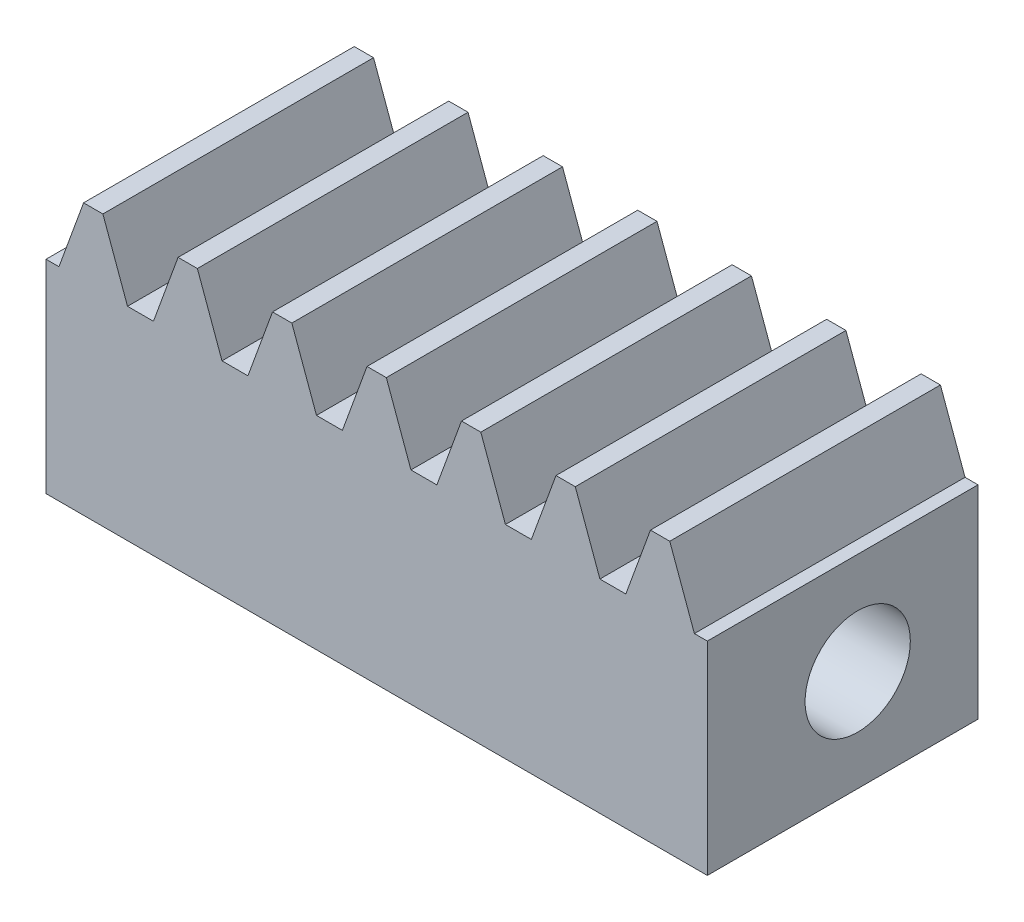
ISO-10303-21;
HEADER;
FILE_DESCRIPTION(('STEP AP214'),'2;1');
FILE_NAME('part.step','',(''),(''),'','','');
FILE_SCHEMA(('AUTOMOTIVE_DESIGN { 1 0 10303 214 1 1 1 1 }'));
ENDSEC;
DATA;
#1=APPLICATION_CONTEXT('core data for automotive mechanical design processes');
#2=APPLICATION_PROTOCOL_DEFINITION('international standard','automotive_design',2000,#1);
#3=PRODUCT_CONTEXT('',#1,'mechanical');
#4=PRODUCT('Part','Part','',(#3));
#5=PRODUCT_RELATED_PRODUCT_CATEGORY('part','',(#4));
#6=PRODUCT_DEFINITION_FORMATION('','',#4);
#7=PRODUCT_DEFINITION_CONTEXT('part definition',#1,'design');
#8=PRODUCT_DEFINITION('design','',#6,#7);
#9=PRODUCT_DEFINITION_SHAPE('','',#8);
#10=(LENGTH_UNIT() NAMED_UNIT(*) SI_UNIT(.MILLI.,.METRE.));
#11=(NAMED_UNIT(*) PLANE_ANGLE_UNIT() SI_UNIT($,.RADIAN.));
#12=(NAMED_UNIT(*) SI_UNIT($,.STERADIAN.) SOLID_ANGLE_UNIT());
#13=UNCERTAINTY_MEASURE_WITH_UNIT(LENGTH_MEASURE(1.E-05),#10,'distance_accuracy_value','');
#14=(GEOMETRIC_REPRESENTATION_CONTEXT(3) GLOBAL_UNCERTAINTY_ASSIGNED_CONTEXT((#13)) GLOBAL_UNIT_ASSIGNED_CONTEXT((#10,
#11,#12)) REPRESENTATION_CONTEXT('',''));
#15=CARTESIAN_POINT('',(0.,0.,0.));
#16=DIRECTION('',(0.,0.,1.));
#17=DIRECTION('',(1.,0.,0.));
#18=AXIS2_PLACEMENT_3D('',#15,#16,#17);
#19=CARTESIAN_POINT('',(0.,42.,20.));
#20=DIRECTION('',(0.,1.,0.));
#21=DIRECTION('',(0.,0.,-1.));
#22=AXIS2_PLACEMENT_3D('',#19,#20,#21);
#23=PLANE('',#22);
#24=DIRECTION('',(1.,0.,0.));
#25=VECTOR('',#24,1.);
#26=CARTESIAN_POINT('',(40.1988485935324,42.,3.33974571428572));
#27=LINE('',#26,#25);
#28=CARTESIAN_POINT('',(40.1988485935324,42.,3.33974571428572));
#29=VERTEX_POINT('',#28);
#30=CARTESIAN_POINT('',(41.4825603064676,42.,3.33974571428572));
#31=VERTEX_POINT('',#30);
#32=EDGE_CURVE('E715',#29,#31,#27,.T.);
#33=ORIENTED_EDGE('',*,*,#32,.F.);
#34=DIRECTION('',(0.,0.,1.));
#35=VECTOR('',#34,1.);
#36=CARTESIAN_POINT('',(40.1988485935324,42.,20.));
#37=LINE('',#36,#35);
#38=CARTESIAN_POINT('',(40.1988485935324,42.,21.3397457142857));
#39=VERTEX_POINT('',#38);
#40=EDGE_CURVE('E555',#29,#39,#37,.T.);
#41=ORIENTED_EDGE('',*,*,#40,.T.);
#42=DIRECTION('',(1.,0.,0.));
#43=VECTOR('',#42,1.);
#44=CARTESIAN_POINT('',(-18.0497899871147,42.,21.3397457142857));
#45=LINE('',#44,#43);
#46=CARTESIAN_POINT('',(41.4825603064676,42.,21.3397457142857));
#47=VERTEX_POINT('',#46);
#48=EDGE_CURVE('E552',#39,#47,#45,.T.);
#49=ORIENTED_EDGE('',*,*,#48,.T.);
#50=DIRECTION('',(0.,0.,-1.));
#51=VECTOR('',#50,1.);
#52=CARTESIAN_POINT('',(41.4825603064676,42.,20.));
#53=LINE('',#52,#51);
#54=EDGE_CURVE('E554',#47,#31,#53,.T.);
#55=ORIENTED_EDGE('',*,*,#54,.T.);
#56=EDGE_LOOP('',(#33,#41,#49,#55));
#57=FACE_BOUND('',#56,.T.);
#58=ADVANCED_FACE('F316',(#57),#23,.T.);
#59=DIRECTION('',(1.,0.,0.));
#60=VECTOR('',#59,1.);
#61=CARTESIAN_POINT('',(33.9156632935324,42.,3.33974571428572));
#62=LINE('',#61,#60);
#63=CARTESIAN_POINT('',(33.9156632935324,42.,3.33974571428572));
#64=VERTEX_POINT('',#63);
#65=CARTESIAN_POINT('',(35.1993750064676,42.,3.33974571428572));
#66=VERTEX_POINT('',#65);
#67=EDGE_CURVE('E695',#64,#66,#62,.T.);
#68=ORIENTED_EDGE('',*,*,#67,.F.);
#69=DIRECTION('',(0.,0.,1.));
#70=VECTOR('',#69,1.);
#71=CARTESIAN_POINT('',(33.9156632935324,42.,20.));
#72=LINE('',#71,#70);
#73=CARTESIAN_POINT('',(33.9156632935324,42.,21.3397457142857));
#74=VERTEX_POINT('',#73);
#75=EDGE_CURVE('E809',#64,#74,#72,.T.);
#76=ORIENTED_EDGE('',*,*,#75,.T.);
#77=CARTESIAN_POINT('',(35.1993750064676,42.,21.3397457142857));
#78=VERTEX_POINT('',#77);
#79=EDGE_CURVE('E556',#74,#78,#45,.T.);
#80=ORIENTED_EDGE('',*,*,#79,.T.);
#81=DIRECTION('',(0.,0.,-1.));
#82=VECTOR('',#81,1.);
#83=CARTESIAN_POINT('',(35.1993750064676,42.,20.));
#84=LINE('',#83,#82);
#85=EDGE_CURVE('E806',#78,#66,#84,.T.);
#86=ORIENTED_EDGE('',*,*,#85,.T.);
#87=EDGE_LOOP('',(#68,#76,#80,#86));
#88=FACE_BOUND('',#87,.T.);
#89=ADVANCED_FACE('F991',(#88),#23,.T.);
#90=DIRECTION('',(1.,0.,0.));
#91=VECTOR('',#90,1.);
#92=CARTESIAN_POINT('',(27.6324779935324,42.,3.33974571428572));
#93=LINE('',#92,#91);
#94=CARTESIAN_POINT('',(27.6324779935324,42.,3.33974571428572));
#95=VERTEX_POINT('',#94);
#96=CARTESIAN_POINT('',(28.9161897064676,42.,3.33974571428572));
#97=VERTEX_POINT('',#96);
#98=EDGE_CURVE('E675',#95,#97,#93,.T.);
#99=ORIENTED_EDGE('',*,*,#98,.F.);
#100=DIRECTION('',(0.,0.,1.));
#101=VECTOR('',#100,1.);
#102=CARTESIAN_POINT('',(27.6324779935324,42.,20.));
#103=LINE('',#102,#101);
#104=CARTESIAN_POINT('',(27.6324779935324,42.,21.3397457142857));
#105=VERTEX_POINT('',#104);
#106=EDGE_CURVE('E800',#95,#105,#103,.T.);
#107=ORIENTED_EDGE('',*,*,#106,.T.);
#108=CARTESIAN_POINT('',(28.9161897064676,42.,21.3397457142857));
#109=VERTEX_POINT('',#108);
#110=EDGE_CURVE('E791',#105,#109,#45,.T.);
#111=ORIENTED_EDGE('',*,*,#110,.T.);
#112=DIRECTION('',(0.,0.,-1.));
#113=VECTOR('',#112,1.);
#114=CARTESIAN_POINT('',(28.9161897064676,42.,20.));
#115=LINE('',#114,#113);
#116=EDGE_CURVE('E797',#109,#97,#115,.T.);
#117=ORIENTED_EDGE('',*,*,#116,.T.);
#118=EDGE_LOOP('',(#99,#107,#111,#117));
#119=FACE_BOUND('',#118,.T.);
#120=ADVANCED_FACE('F979',(#119),#23,.T.);
#121=DIRECTION('',(1.,0.,0.));
#122=VECTOR('',#121,1.);
#123=CARTESIAN_POINT('',(21.3492926935324,42.,3.33974571428572));
#124=LINE('',#123,#122);
#125=CARTESIAN_POINT('',(21.3492926935324,42.,3.33974571428572));
#126=VERTEX_POINT('',#125);
#127=CARTESIAN_POINT('',(22.6330044064676,42.,3.33974571428572));
#128=VERTEX_POINT('',#127);
#129=EDGE_CURVE('E655',#126,#128,#124,.T.);
#130=ORIENTED_EDGE('',*,*,#129,.F.);
#131=DIRECTION('',(0.,0.,1.));
#132=VECTOR('',#131,1.);
#133=CARTESIAN_POINT('',(21.3492926935324,42.,20.));
#134=LINE('',#133,#132);
#135=CARTESIAN_POINT('',(21.3492926935324,42.,21.3397457142857));
#136=VERTEX_POINT('',#135);
#137=EDGE_CURVE('E790',#126,#136,#134,.T.);
#138=ORIENTED_EDGE('',*,*,#137,.T.);
#139=CARTESIAN_POINT('',(22.6330044064676,42.,21.3397457142857));
#140=VERTEX_POINT('',#139);
#141=EDGE_CURVE('E782',#136,#140,#45,.T.);
#142=ORIENTED_EDGE('',*,*,#141,.T.);
#143=DIRECTION('',(0.,0.,-1.));
#144=VECTOR('',#143,1.);
#145=CARTESIAN_POINT('',(22.6330044064676,42.,20.));
#146=LINE('',#145,#144);
#147=EDGE_CURVE('E788',#140,#128,#146,.T.);
#148=ORIENTED_EDGE('',*,*,#147,.T.);
#149=EDGE_LOOP('',(#130,#138,#142,#148));
#150=FACE_BOUND('',#149,.T.);
#151=ADVANCED_FACE('F997',(#150),#23,.T.);
#152=DIRECTION('',(1.,0.,0.));
#153=VECTOR('',#152,1.);
#154=CARTESIAN_POINT('',(15.0661073935324,42.,3.33974571428572));
#155=LINE('',#154,#153);
#156=CARTESIAN_POINT('',(15.0661073935324,42.,3.33974571428572));
#157=VERTEX_POINT('',#156);
#158=CARTESIAN_POINT('',(16.3498191064676,42.,3.33974571428572));
#159=VERTEX_POINT('',#158);
#160=EDGE_CURVE('E635',#157,#159,#155,.T.);
#161=ORIENTED_EDGE('',*,*,#160,.F.);
#162=DIRECTION('',(0.,0.,1.));
#163=VECTOR('',#162,1.);
#164=CARTESIAN_POINT('',(15.0661073935324,42.,20.));
#165=LINE('',#164,#163);
#166=CARTESIAN_POINT('',(15.0661073935324,42.,21.3397457142857));
#167=VERTEX_POINT('',#166);
#168=EDGE_CURVE('E781',#157,#167,#165,.T.);
#169=ORIENTED_EDGE('',*,*,#168,.T.);
#170=CARTESIAN_POINT('',(16.3498191064676,42.,21.3397457142857));
#171=VERTEX_POINT('',#170);
#172=EDGE_CURVE('E777',#167,#171,#45,.T.);
#173=ORIENTED_EDGE('',*,*,#172,.T.);
#174=DIRECTION('',(0.,0.,-1.));
#175=VECTOR('',#174,1.);
#176=CARTESIAN_POINT('',(16.3498191064676,42.,20.));
#177=LINE('',#176,#175);
#178=EDGE_CURVE('E779',#171,#159,#177,.T.);
#179=ORIENTED_EDGE('',*,*,#178,.T.);
#180=EDGE_LOOP('',(#161,#169,#173,#179));
#181=FACE_BOUND('',#180,.T.);
#182=ADVANCED_FACE('F1007',(#181),#23,.T.);
#183=DIRECTION('',(1.,0.,0.));
#184=VECTOR('',#183,1.);
#185=CARTESIAN_POINT('',(8.78292209353239,42.,3.33974571428572));
#186=LINE('',#185,#184);
#187=CARTESIAN_POINT('',(8.78292209353239,42.,3.33974571428572));
#188=VERTEX_POINT('',#187);
#189=CARTESIAN_POINT('',(10.0666338064676,42.,3.33974571428572));
#190=VERTEX_POINT('',#189);
#191=EDGE_CURVE('E609',#188,#190,#186,.T.);
#192=ORIENTED_EDGE('',*,*,#191,.F.);
#193=DIRECTION('',(0.,0.,1.));
#194=VECTOR('',#193,1.);
#195=CARTESIAN_POINT('',(8.7829220935324,42.,20.));
#196=LINE('',#195,#194);
#197=CARTESIAN_POINT('',(8.7829220935324,42.,21.3397457142857));
#198=VERTEX_POINT('',#197);
#199=EDGE_CURVE('E570',#188,#198,#196,.T.);
#200=ORIENTED_EDGE('',*,*,#199,.T.);
#201=CARTESIAN_POINT('',(10.0666338064676,42.,21.3397457142857));
#202=VERTEX_POINT('',#201);
#203=EDGE_CURVE('E770',#198,#202,#45,.T.);
#204=ORIENTED_EDGE('',*,*,#203,.T.);
#205=DIRECTION('',(0.,0.,-1.));
#206=VECTOR('',#205,1.);
#207=CARTESIAN_POINT('',(10.0666338064676,42.,20.));
#208=LINE('',#207,#206);
#209=EDGE_CURVE('E583',#202,#190,#208,.T.);
#210=ORIENTED_EDGE('',*,*,#209,.T.);
#211=EDGE_LOOP('',(#192,#200,#204,#210));
#212=FACE_BOUND('',#211,.T.);
#213=ADVANCED_FACE('F929',(#212),#23,.T.);
#214=DIRECTION('',(1.,0.,0.));
#215=VECTOR('',#214,1.);
#216=CARTESIAN_POINT('',(2.49973679353239,42.,3.33974571428572));
#217=LINE('',#216,#215);
#218=CARTESIAN_POINT('',(2.49973679353239,42.,3.33974571428572));
#219=VERTEX_POINT('',#218);
#220=CARTESIAN_POINT('',(3.78344850646761,42.,3.33974571428572));
#221=VERTEX_POINT('',#220);
#222=EDGE_CURVE('E607',#219,#221,#217,.T.);
#223=ORIENTED_EDGE('',*,*,#222,.F.);
#224=DIRECTION('',(0.,0.,1.));
#225=VECTOR('',#224,1.);
#226=CARTESIAN_POINT('',(2.49973679353239,42.,20.));
#227=LINE('',#226,#225);
#228=CARTESIAN_POINT('',(2.4997367935324,42.,21.3397457142857));
#229=VERTEX_POINT('',#228);
#230=EDGE_CURVE('E319',#219,#229,#227,.T.);
#231=ORIENTED_EDGE('',*,*,#230,.T.);
#232=CARTESIAN_POINT('',(3.78344850646761,42.,21.3397457142857));
#233=VERTEX_POINT('',#232);
#234=EDGE_CURVE('E557',#229,#233,#45,.T.);
#235=ORIENTED_EDGE('',*,*,#234,.T.);
#236=DIRECTION('',(0.,0.,-1.));
#237=VECTOR('',#236,1.);
#238=CARTESIAN_POINT('',(3.78344850646762,42.,20.));
#239=LINE('',#238,#237);
#240=EDGE_CURVE('E551',#233,#221,#239,.T.);
#241=ORIENTED_EDGE('',*,*,#240,.T.);
#242=EDGE_LOOP('',(#223,#231,#235,#241));
#243=FACE_BOUND('',#242,.T.);
#244=ADVANCED_FACE('F764',(#243),#23,.T.);
#245=CARTESIAN_POINT('',(0.,0.,20.));
#246=DIRECTION('',(-1.,0.,0.));
#247=DIRECTION('',(0.,0.,-1.));
#248=AXIS2_PLACEMENT_3D('',#245,#246,#247);
#249=PLANE('',#248);
#250=DIRECTION('',(0.,1.,0.));
#251=VECTOR('',#250,1.);
#252=CARTESIAN_POINT('',(0.,24.,3.33974571428572));
#253=LINE('',#252,#251);
#254=CARTESIAN_POINT('',(0.,24.,3.33974571428572));
#255=VERTEX_POINT('',#254);
#256=CARTESIAN_POINT('',(0.,37.5,3.33974571428572));
#257=VERTEX_POINT('',#256);
#258=EDGE_CURVE('E735',#255,#257,#253,.T.);
#259=ORIENTED_EDGE('',*,*,#258,.F.);
#260=DIRECTION('',(0.,0.,-1.));
#261=VECTOR('',#260,1.);
#262=CARTESIAN_POINT('',(0.,24.,20.));
#263=LINE('',#262,#261);
#264=CARTESIAN_POINT('',(0.,24.,21.3397457142857));
#265=VERTEX_POINT('',#264);
#266=EDGE_CURVE('E456',#265,#255,#263,.T.);
#267=ORIENTED_EDGE('',*,*,#266,.F.);
#268=DIRECTION('',(0.,1.,0.));
#269=VECTOR('',#268,1.);
#270=CARTESIAN_POINT('',(0.,24.,21.3397457142857));
#271=LINE('',#270,#269);
#272=CARTESIAN_POINT('',(0.,37.5,21.3397457142857));
#273=VERTEX_POINT('',#272);
#274=EDGE_CURVE('E436',#265,#273,#271,.T.);
#275=ORIENTED_EDGE('',*,*,#274,.T.);
#276=DIRECTION('',(0.,0.,-1.));
#277=VECTOR('',#276,1.);
#278=CARTESIAN_POINT('',(0.,37.5,20.));
#279=LINE('',#278,#277);
#280=EDGE_CURVE('E477',#273,#257,#279,.T.);
#281=ORIENTED_EDGE('',*,*,#280,.T.);
#282=EDGE_LOOP('',(#259,#267,#275,#281));
#283=FACE_BOUND('',#282,.T.);
#284=CARTESIAN_POINT('',(0.,30.75,11.3397457142857));
#285=DIRECTION('',(-1.,0.,0.));
#286=DIRECTION('',(0.,0.,1.));
#287=AXIS2_PLACEMENT_3D('',#284,#285,#286);
#288=CIRCLE('',#287,3.5);
#289=CARTESIAN_POINT('',(0.,30.75,14.8397457142857));
#290=VERTEX_POINT('',#289);
#291=EDGE_CURVE('E459',#290,#290,#288,.T.);
#292=ORIENTED_EDGE('',*,*,#291,.F.);
#293=EDGE_LOOP('',(#292));
#294=FACE_BOUND('',#293,.T.);
#295=ADVANCED_FACE('F1001',(#283,#294),#249,.T.);
#296=CARTESIAN_POINT('',(2.50898163748275,42.0254,20.));
#297=DIRECTION('',(0.93969262078591,-0.342020143325663,0.));
#298=DIRECTION('',(0.342020143325663,0.939692620785911,0.));
#299=AXIS2_PLACEMENT_3D('',#296,#297,#298);
#300=PLANE('',#299);
#301=ORIENTED_EDGE('',*,*,#230,.F.);
#302=DIRECTION('',(0.342020143325662,0.939692620785911,0.));
#303=VECTOR('',#302,1.);
#304=CARTESIAN_POINT('',(0.861870739334514,37.5,3.33974571428572));
#305=LINE('',#304,#303);
#306=CARTESIAN_POINT('',(0.861870739334514,37.5,3.33974571428572));
#307=VERTEX_POINT('',#306);
#308=EDGE_CURVE('E751',#307,#219,#305,.T.);
#309=ORIENTED_EDGE('',*,*,#308,.F.);
#310=DIRECTION('',(0.,0.,-1.));
#311=VECTOR('',#310,1.);
#312=CARTESIAN_POINT('',(0.861870739334514,37.5,20.));
#313=LINE('',#312,#311);
#314=CARTESIAN_POINT('',(0.861870739334514,37.5,21.3397457142857));
#315=VERTEX_POINT('',#314);
#316=EDGE_CURVE('E476',#315,#307,#313,.T.);
#317=ORIENTED_EDGE('',*,*,#316,.F.);
#318=DIRECTION('',(0.342020143325663,0.939692620785911,0.));
#319=VECTOR('',#318,1.);
#320=CARTESIAN_POINT('',(2.50898163748275,42.0254,21.3397457142857));
#321=LINE('',#320,#319);
#322=EDGE_CURVE('E342',#315,#229,#321,.T.);
#323=ORIENTED_EDGE('',*,*,#322,.T.);
#324=EDGE_LOOP('',(#301,#309,#317,#323));
#325=FACE_BOUND('',#324,.T.);
#326=ADVANCED_FACE('F768',(#325),#300,.F.);
#327=CARTESIAN_POINT('',(0.861870739334514,37.5,20.));
#328=DIRECTION('',(0.,-1.,0.));
#329=DIRECTION('',(0.,0.,1.));
#330=AXIS2_PLACEMENT_3D('',#327,#328,#329);
#331=PLANE('',#330);
#332=ORIENTED_EDGE('',*,*,#316,.T.);
#333=DIRECTION('',(1.,0.,0.));
#334=VECTOR('',#333,1.);
#335=CARTESIAN_POINT('',(0.,37.5,3.33974571428572));
#336=LINE('',#335,#334);
#337=EDGE_CURVE('E739',#257,#307,#336,.T.);
#338=ORIENTED_EDGE('',*,*,#337,.F.);
#339=ORIENTED_EDGE('',*,*,#280,.F.);
#340=DIRECTION('',(1.,0.,0.));
#341=VECTOR('',#340,1.);
#342=CARTESIAN_POINT('',(0.861870739334514,37.5,21.3397457142857));
#343=LINE('',#342,#341);
#344=EDGE_CURVE('E478',#273,#315,#343,.T.);
#345=ORIENTED_EDGE('',*,*,#344,.T.);
#346=EDGE_LOOP('',(#332,#338,#339,#345));
#347=FACE_BOUND('',#346,.T.);
#348=ADVANCED_FACE('F1062',(#347),#331,.F.);
#349=CARTESIAN_POINT('',(3.77420366251726,42.0254,20.));
#350=DIRECTION('',(-0.93969262078591,-0.342020143325663,0.));
#351=DIRECTION('',(0.342020143325663,-0.939692620785911,0.));
#352=AXIS2_PLACEMENT_3D('',#349,#350,#351);
#353=PLANE('',#352);
#354=DIRECTION('',(0.,0.,-1.));
#355=VECTOR('',#354,1.);
#356=CARTESIAN_POINT('',(5.4213145606655,37.5,20.));
#357=LINE('',#356,#355);
#358=CARTESIAN_POINT('',(5.4213145606655,37.5,21.3397457142857));
#359=VERTEX_POINT('',#358);
#360=CARTESIAN_POINT('',(5.4213145606655,37.5,3.33974571428572));
#361=VERTEX_POINT('',#360);
#362=EDGE_CURVE('E480',#359,#361,#357,.T.);
#363=ORIENTED_EDGE('',*,*,#362,.T.);
#364=DIRECTION('',(0.342020143325664,-0.93969262078591,0.));
#365=VECTOR('',#364,1.);
#366=CARTESIAN_POINT('',(3.78344850646761,42.,3.33974571428572));
#367=LINE('',#366,#365);
#368=EDGE_CURVE('E594',#221,#361,#367,.T.);
#369=ORIENTED_EDGE('',*,*,#368,.F.);
#370=ORIENTED_EDGE('',*,*,#240,.F.);
#371=DIRECTION('',(0.342020143325663,-0.939692620785911,0.));
#372=VECTOR('',#371,1.);
#373=CARTESIAN_POINT('',(3.77420366251726,42.0254,21.3397457142857));
#374=LINE('',#373,#372);
#375=EDGE_CURVE('E481',#233,#359,#374,.T.);
#376=ORIENTED_EDGE('',*,*,#375,.T.);
#377=EDGE_LOOP('',(#363,#369,#370,#376));
#378=FACE_BOUND('',#377,.T.);
#379=ADVANCED_FACE('F590',(#378),#353,.F.);
#380=CARTESIAN_POINT('',(8.79216693748275,42.0254,20.));
#381=DIRECTION('',(0.93969262078591,-0.342020143325663,0.));
#382=DIRECTION('',(0.342020143325663,0.939692620785911,0.));
#383=AXIS2_PLACEMENT_3D('',#380,#381,#382);
#384=PLANE('',#383);
#385=ORIENTED_EDGE('',*,*,#199,.F.);
#386=DIRECTION('',(0.342020143325662,0.939692620785911,0.));
#387=VECTOR('',#386,1.);
#388=CARTESIAN_POINT('',(7.14505603933452,37.5,3.33974571428572));
#389=LINE('',#388,#387);
#390=CARTESIAN_POINT('',(7.14505603933452,37.5,3.33974571428572));
#391=VERTEX_POINT('',#390);
#392=EDGE_CURVE('E605',#391,#188,#389,.T.);
#393=ORIENTED_EDGE('',*,*,#392,.F.);
#394=DIRECTION('',(0.,0.,-1.));
#395=VECTOR('',#394,1.);
#396=CARTESIAN_POINT('',(7.14505603933452,37.5,20.));
#397=LINE('',#396,#395);
#398=CARTESIAN_POINT('',(7.14505603933452,37.5,21.3397457142857));
#399=VERTEX_POINT('',#398);
#400=EDGE_CURVE('E487',#399,#391,#397,.T.);
#401=ORIENTED_EDGE('',*,*,#400,.F.);
#402=DIRECTION('',(0.342020143325663,0.939692620785911,0.));
#403=VECTOR('',#402,1.);
#404=CARTESIAN_POINT('',(8.79216693748275,42.0254,21.3397457142857));
#405=LINE('',#404,#403);
#406=EDGE_CURVE('E484',#399,#198,#405,.T.);
#407=ORIENTED_EDGE('',*,*,#406,.T.);
#408=EDGE_LOOP('',(#385,#393,#401,#407));
#409=FACE_BOUND('',#408,.T.);
#410=ADVANCED_FACE('F930',(#409),#384,.F.);
#411=CARTESIAN_POINT('',(7.14505603933452,37.5,20.));
#412=DIRECTION('',(0.,-1.,0.));
#413=DIRECTION('',(0.,0.,1.));
#414=AXIS2_PLACEMENT_3D('',#411,#412,#413);
#415=PLANE('',#414);
#416=ORIENTED_EDGE('',*,*,#400,.T.);
#417=DIRECTION('',(1.,0.,0.));
#418=VECTOR('',#417,1.);
#419=CARTESIAN_POINT('',(5.4213145606655,37.5,3.33974571428572));
#420=LINE('',#419,#418);
#421=EDGE_CURVE('E602',#361,#391,#420,.T.);
#422=ORIENTED_EDGE('',*,*,#421,.F.);
#423=ORIENTED_EDGE('',*,*,#362,.F.);
#424=DIRECTION('',(1.,0.,0.));
#425=VECTOR('',#424,1.);
#426=CARTESIAN_POINT('',(7.14505603933452,37.5,21.3397457142857));
#427=LINE('',#426,#425);
#428=EDGE_CURVE('E488',#359,#399,#427,.T.);
#429=ORIENTED_EDGE('',*,*,#428,.T.);
#430=EDGE_LOOP('',(#416,#422,#423,#429));
#431=FACE_BOUND('',#430,.T.);
#432=ADVANCED_FACE('F599',(#431),#415,.F.);
#433=CARTESIAN_POINT('',(10.0573889625173,42.0254,20.));
#434=DIRECTION('',(-0.93969262078591,-0.342020143325663,0.));
#435=DIRECTION('',(0.342020143325663,-0.939692620785911,0.));
#436=AXIS2_PLACEMENT_3D('',#433,#434,#435);
#437=PLANE('',#436);
#438=DIRECTION('',(0.,0.,-1.));
#439=VECTOR('',#438,1.);
#440=CARTESIAN_POINT('',(11.7044998606655,37.5,20.));
#441=LINE('',#440,#439);
#442=CARTESIAN_POINT('',(11.7044998606655,37.5,21.3397457142857));
#443=VERTEX_POINT('',#442);
#444=CARTESIAN_POINT('',(11.7044998606655,37.5,3.33974571428572));
#445=VERTEX_POINT('',#444);
#446=EDGE_CURVE('E491',#443,#445,#441,.T.);
#447=ORIENTED_EDGE('',*,*,#446,.T.);
#448=DIRECTION('',(0.342020143325664,-0.93969262078591,0.));
#449=VECTOR('',#448,1.);
#450=CARTESIAN_POINT('',(10.0666338064676,42.,3.33974571428572));
#451=LINE('',#450,#449);
#452=EDGE_CURVE('E620',#190,#445,#451,.T.);
#453=ORIENTED_EDGE('',*,*,#452,.F.);
#454=ORIENTED_EDGE('',*,*,#209,.F.);
#455=DIRECTION('',(0.342020143325663,-0.939692620785911,0.));
#456=VECTOR('',#455,1.);
#457=CARTESIAN_POINT('',(10.0573889625173,42.0254,21.3397457142857));
#458=LINE('',#457,#456);
#459=EDGE_CURVE('E492',#202,#443,#458,.T.);
#460=ORIENTED_EDGE('',*,*,#459,.T.);
#461=EDGE_LOOP('',(#447,#453,#454,#460));
#462=FACE_BOUND('',#461,.T.);
#463=ADVANCED_FACE('F934',(#462),#437,.F.);
#464=CARTESIAN_POINT('',(15.0753522374828,42.0254,20.));
#465=DIRECTION('',(0.93969262078591,-0.342020143325663,0.));
#466=DIRECTION('',(0.342020143325663,0.939692620785911,0.));
#467=AXIS2_PLACEMENT_3D('',#464,#465,#466);
#468=PLANE('',#467);
#469=ORIENTED_EDGE('',*,*,#168,.F.);
#470=DIRECTION('',(0.342020143325662,0.939692620785911,0.));
#471=VECTOR('',#470,1.);
#472=CARTESIAN_POINT('',(13.4282413393345,37.5,3.33974571428572));
#473=LINE('',#472,#471);
#474=CARTESIAN_POINT('',(13.4282413393345,37.5,3.33974571428572));
#475=VERTEX_POINT('',#474);
#476=EDGE_CURVE('E630',#475,#157,#473,.T.);
#477=ORIENTED_EDGE('',*,*,#476,.F.);
#478=DIRECTION('',(0.,0.,-1.));
#479=VECTOR('',#478,1.);
#480=CARTESIAN_POINT('',(13.4282413393345,37.5,20.));
#481=LINE('',#480,#479);
#482=CARTESIAN_POINT('',(13.4282413393345,37.5,21.3397457142857));
#483=VERTEX_POINT('',#482);
#484=EDGE_CURVE('E498',#483,#475,#481,.T.);
#485=ORIENTED_EDGE('',*,*,#484,.F.);
#486=DIRECTION('',(0.342020143325663,0.939692620785911,0.));
#487=VECTOR('',#486,1.);
#488=CARTESIAN_POINT('',(15.0753522374828,42.0254,21.3397457142857));
#489=LINE('',#488,#487);
#490=EDGE_CURVE('E495',#483,#167,#489,.T.);
#491=ORIENTED_EDGE('',*,*,#490,.T.);
#492=EDGE_LOOP('',(#469,#477,#485,#491));
#493=FACE_BOUND('',#492,.T.);
#494=ADVANCED_FACE('F1019',(#493),#468,.F.);
#495=CARTESIAN_POINT('',(13.4282413393345,37.5,20.));
#496=DIRECTION('',(0.,-1.,0.));
#497=DIRECTION('',(0.,0.,1.));
#498=AXIS2_PLACEMENT_3D('',#495,#496,#497);
#499=PLANE('',#498);
#500=ORIENTED_EDGE('',*,*,#484,.T.);
#501=DIRECTION('',(1.,0.,0.));
#502=VECTOR('',#501,1.);
#503=CARTESIAN_POINT('',(11.7044998606655,37.5,3.33974571428572));
#504=LINE('',#503,#502);
#505=EDGE_CURVE('E625',#445,#475,#504,.T.);
#506=ORIENTED_EDGE('',*,*,#505,.F.);
#507=ORIENTED_EDGE('',*,*,#446,.F.);
#508=DIRECTION('',(1.,0.,0.));
#509=VECTOR('',#508,1.);
#510=CARTESIAN_POINT('',(13.4282413393345,37.5,21.3397457142857));
#511=LINE('',#510,#509);
#512=EDGE_CURVE('E499',#443,#483,#511,.T.);
#513=ORIENTED_EDGE('',*,*,#512,.T.);
#514=EDGE_LOOP('',(#500,#506,#507,#513));
#515=FACE_BOUND('',#514,.T.);
#516=ADVANCED_FACE('F938',(#515),#499,.F.);
#517=CARTESIAN_POINT('',(16.3405742625173,42.0254,20.));
#518=DIRECTION('',(-0.93969262078591,-0.342020143325663,0.));
#519=DIRECTION('',(0.342020143325663,-0.939692620785911,0.));
#520=AXIS2_PLACEMENT_3D('',#517,#518,#519);
#521=PLANE('',#520);
#522=DIRECTION('',(0.,0.,-1.));
#523=VECTOR('',#522,1.);
#524=CARTESIAN_POINT('',(17.9876851606655,37.5,20.));
#525=LINE('',#524,#523);
#526=CARTESIAN_POINT('',(17.9876851606655,37.5,21.3397457142857));
#527=VERTEX_POINT('',#526);
#528=CARTESIAN_POINT('',(17.9876851606655,37.5,3.33974571428572));
#529=VERTEX_POINT('',#528);
#530=EDGE_CURVE('E502',#527,#529,#525,.T.);
#531=ORIENTED_EDGE('',*,*,#530,.T.);
#532=DIRECTION('',(0.342020143325664,-0.93969262078591,0.));
#533=VECTOR('',#532,1.);
#534=CARTESIAN_POINT('',(16.3498191064676,42.,3.33974571428572));
#535=LINE('',#534,#533);
#536=EDGE_CURVE('E640',#159,#529,#535,.T.);
#537=ORIENTED_EDGE('',*,*,#536,.F.);
#538=ORIENTED_EDGE('',*,*,#178,.F.);
#539=DIRECTION('',(0.342020143325663,-0.939692620785911,0.));
#540=VECTOR('',#539,1.);
#541=CARTESIAN_POINT('',(16.3405742625173,42.0254,21.3397457142857));
#542=LINE('',#541,#540);
#543=EDGE_CURVE('E503',#171,#527,#542,.T.);
#544=ORIENTED_EDGE('',*,*,#543,.T.);
#545=EDGE_LOOP('',(#531,#537,#538,#544));
#546=FACE_BOUND('',#545,.T.);
#547=ADVANCED_FACE('F1022',(#546),#521,.F.);
#548=CARTESIAN_POINT('',(21.3585375374828,42.0254,20.));
#549=DIRECTION('',(0.93969262078591,-0.342020143325663,0.));
#550=DIRECTION('',(0.342020143325663,0.939692620785911,0.));
#551=AXIS2_PLACEMENT_3D('',#548,#549,#550);
#552=PLANE('',#551);
#553=ORIENTED_EDGE('',*,*,#137,.F.);
#554=DIRECTION('',(0.342020143325662,0.939692620785911,0.));
#555=VECTOR('',#554,1.);
#556=CARTESIAN_POINT('',(19.7114266393345,37.5,3.33974571428572));
#557=LINE('',#556,#555);
#558=CARTESIAN_POINT('',(19.7114266393345,37.5,3.33974571428572));
#559=VERTEX_POINT('',#558);
#560=EDGE_CURVE('E650',#559,#126,#557,.T.);
#561=ORIENTED_EDGE('',*,*,#560,.F.);
#562=DIRECTION('',(0.,0.,-1.));
#563=VECTOR('',#562,1.);
#564=CARTESIAN_POINT('',(19.7114266393345,37.5,20.));
#565=LINE('',#564,#563);
#566=CARTESIAN_POINT('',(19.7114266393345,37.5,21.3397457142857));
#567=VERTEX_POINT('',#566);
#568=EDGE_CURVE('E509',#567,#559,#565,.T.);
#569=ORIENTED_EDGE('',*,*,#568,.F.);
#570=DIRECTION('',(0.342020143325663,0.939692620785911,0.));
#571=VECTOR('',#570,1.);
#572=CARTESIAN_POINT('',(21.3585375374828,42.0254,21.3397457142857));
#573=LINE('',#572,#571);
#574=EDGE_CURVE('E506',#567,#136,#573,.T.);
#575=ORIENTED_EDGE('',*,*,#574,.T.);
#576=EDGE_LOOP('',(#553,#561,#569,#575));
#577=FACE_BOUND('',#576,.T.);
#578=ADVANCED_FACE('F1032',(#577),#552,.F.);
#579=CARTESIAN_POINT('',(19.7114266393345,37.5,20.));
#580=DIRECTION('',(0.,-1.,0.));
#581=DIRECTION('',(0.,0.,1.));
#582=AXIS2_PLACEMENT_3D('',#579,#580,#581);
#583=PLANE('',#582);
#584=ORIENTED_EDGE('',*,*,#568,.T.);
#585=DIRECTION('',(1.,0.,0.));
#586=VECTOR('',#585,1.);
#587=CARTESIAN_POINT('',(17.9876851606655,37.5,3.33974571428572));
#588=LINE('',#587,#586);
#589=EDGE_CURVE('E645',#529,#559,#588,.T.);
#590=ORIENTED_EDGE('',*,*,#589,.F.);
#591=ORIENTED_EDGE('',*,*,#530,.F.);
#592=DIRECTION('',(1.,0.,0.));
#593=VECTOR('',#592,1.);
#594=CARTESIAN_POINT('',(19.7114266393345,37.5,21.3397457142857));
#595=LINE('',#594,#593);
#596=EDGE_CURVE('E510',#527,#567,#595,.T.);
#597=ORIENTED_EDGE('',*,*,#596,.T.);
#598=EDGE_LOOP('',(#584,#590,#591,#597));
#599=FACE_BOUND('',#598,.T.);
#600=ADVANCED_FACE('F1026',(#599),#583,.F.);
#601=CARTESIAN_POINT('',(22.6237595625173,42.0254,20.));
#602=DIRECTION('',(-0.93969262078591,-0.342020143325663,0.));
#603=DIRECTION('',(0.342020143325663,-0.939692620785911,0.));
#604=AXIS2_PLACEMENT_3D('',#601,#602,#603);
#605=PLANE('',#604);
#606=DIRECTION('',(0.,0.,-1.));
#607=VECTOR('',#606,1.);
#608=CARTESIAN_POINT('',(24.2708704606655,37.5,20.));
#609=LINE('',#608,#607);
#610=CARTESIAN_POINT('',(24.2708704606655,37.5,21.3397457142857));
#611=VERTEX_POINT('',#610);
#612=CARTESIAN_POINT('',(24.2708704606655,37.5,3.33974571428572));
#613=VERTEX_POINT('',#612);
#614=EDGE_CURVE('E513',#611,#613,#609,.T.);
#615=ORIENTED_EDGE('',*,*,#614,.T.);
#616=DIRECTION('',(0.342020143325664,-0.93969262078591,0.));
#617=VECTOR('',#616,1.);
#618=CARTESIAN_POINT('',(22.6330044064676,42.,3.33974571428572));
#619=LINE('',#618,#617);
#620=EDGE_CURVE('E660',#128,#613,#619,.T.);
#621=ORIENTED_EDGE('',*,*,#620,.F.);
#622=ORIENTED_EDGE('',*,*,#147,.F.);
#623=DIRECTION('',(0.342020143325663,-0.939692620785911,0.));
#624=VECTOR('',#623,1.);
#625=CARTESIAN_POINT('',(22.6237595625173,42.0254,21.3397457142857));
#626=LINE('',#625,#624);
#627=EDGE_CURVE('E514',#140,#611,#626,.T.);
#628=ORIENTED_EDGE('',*,*,#627,.T.);
#629=EDGE_LOOP('',(#615,#621,#622,#628));
#630=FACE_BOUND('',#629,.T.);
#631=ADVANCED_FACE('F1034',(#630),#605,.F.);
#632=CARTESIAN_POINT('',(27.6417228374828,42.0254,20.));
#633=DIRECTION('',(0.93969262078591,-0.342020143325663,0.));
#634=DIRECTION('',(0.342020143325663,0.939692620785911,0.));
#635=AXIS2_PLACEMENT_3D('',#632,#633,#634);
#636=PLANE('',#635);
#637=ORIENTED_EDGE('',*,*,#106,.F.);
#638=DIRECTION('',(0.342020143325662,0.939692620785911,0.));
#639=VECTOR('',#638,1.);
#640=CARTESIAN_POINT('',(25.9946119393345,37.5,3.33974571428572));
#641=LINE('',#640,#639);
#642=CARTESIAN_POINT('',(25.9946119393345,37.5,3.33974571428572));
#643=VERTEX_POINT('',#642);
#644=EDGE_CURVE('E670',#643,#95,#641,.T.);
#645=ORIENTED_EDGE('',*,*,#644,.F.);
#646=DIRECTION('',(0.,0.,-1.));
#647=VECTOR('',#646,1.);
#648=CARTESIAN_POINT('',(25.9946119393345,37.5,20.));
#649=LINE('',#648,#647);
#650=CARTESIAN_POINT('',(25.9946119393345,37.5,21.3397457142857));
#651=VERTEX_POINT('',#650);
#652=EDGE_CURVE('E520',#651,#643,#649,.T.);
#653=ORIENTED_EDGE('',*,*,#652,.F.);
#654=DIRECTION('',(0.342020143325663,0.939692620785911,0.));
#655=VECTOR('',#654,1.);
#656=CARTESIAN_POINT('',(27.6417228374828,42.0254,21.3397457142857));
#657=LINE('',#656,#655);
#658=EDGE_CURVE('E517',#651,#105,#657,.T.);
#659=ORIENTED_EDGE('',*,*,#658,.T.);
#660=EDGE_LOOP('',(#637,#645,#653,#659));
#661=FACE_BOUND('',#660,.T.);
#662=ADVANCED_FACE('F976',(#661),#636,.F.);
#663=CARTESIAN_POINT('',(25.9946119393345,37.5,20.));
#664=DIRECTION('',(0.,-1.,0.));
#665=DIRECTION('',(0.,0.,1.));
#666=AXIS2_PLACEMENT_3D('',#663,#664,#665);
#667=PLANE('',#666);
#668=ORIENTED_EDGE('',*,*,#652,.T.);
#669=DIRECTION('',(1.,0.,0.));
#670=VECTOR('',#669,1.);
#671=CARTESIAN_POINT('',(24.2708704606655,37.5,3.33974571428572));
#672=LINE('',#671,#670);
#673=EDGE_CURVE('E665',#613,#643,#672,.T.);
#674=ORIENTED_EDGE('',*,*,#673,.F.);
#675=ORIENTED_EDGE('',*,*,#614,.F.);
#676=DIRECTION('',(1.,0.,0.));
#677=VECTOR('',#676,1.);
#678=CARTESIAN_POINT('',(25.9946119393345,37.5,21.3397457142857));
#679=LINE('',#678,#677);
#680=EDGE_CURVE('E521',#611,#651,#679,.T.);
#681=ORIENTED_EDGE('',*,*,#680,.T.);
#682=EDGE_LOOP('',(#668,#674,#675,#681));
#683=FACE_BOUND('',#682,.T.);
#684=ADVANCED_FACE('F971',(#683),#667,.F.);
#685=CARTESIAN_POINT('',(28.9069448625173,42.0254,20.));
#686=DIRECTION('',(-0.93969262078591,-0.342020143325663,0.));
#687=DIRECTION('',(0.342020143325663,-0.939692620785911,0.));
#688=AXIS2_PLACEMENT_3D('',#685,#686,#687);
#689=PLANE('',#688);
#690=DIRECTION('',(0.,0.,-1.));
#691=VECTOR('',#690,1.);
#692=CARTESIAN_POINT('',(30.5540557606655,37.5,20.));
#693=LINE('',#692,#691);
#694=CARTESIAN_POINT('',(30.5540557606655,37.5,21.3397457142857));
#695=VERTEX_POINT('',#694);
#696=CARTESIAN_POINT('',(30.5540557606655,37.5,3.33974571428572));
#697=VERTEX_POINT('',#696);
#698=EDGE_CURVE('E524',#695,#697,#693,.T.);
#699=ORIENTED_EDGE('',*,*,#698,.T.);
#700=DIRECTION('',(0.342020143325664,-0.93969262078591,0.));
#701=VECTOR('',#700,1.);
#702=CARTESIAN_POINT('',(28.9161897064676,42.,3.33974571428572));
#703=LINE('',#702,#701);
#704=EDGE_CURVE('E680',#97,#697,#703,.T.);
#705=ORIENTED_EDGE('',*,*,#704,.F.);
#706=ORIENTED_EDGE('',*,*,#116,.F.);
#707=DIRECTION('',(0.342020143325663,-0.939692620785911,0.));
#708=VECTOR('',#707,1.);
#709=CARTESIAN_POINT('',(28.9069448625173,42.0254,21.3397457142857));
#710=LINE('',#709,#708);
#711=EDGE_CURVE('E525',#109,#695,#710,.T.);
#712=ORIENTED_EDGE('',*,*,#711,.T.);
#713=EDGE_LOOP('',(#699,#705,#706,#712));
#714=FACE_BOUND('',#713,.T.);
#715=ADVANCED_FACE('F982',(#714),#689,.F.);
#716=CARTESIAN_POINT('',(33.9249081374828,42.0254,20.));
#717=DIRECTION('',(0.93969262078591,-0.342020143325663,0.));
#718=DIRECTION('',(0.342020143325663,0.939692620785911,0.));
#719=AXIS2_PLACEMENT_3D('',#716,#717,#718);
#720=PLANE('',#719);
#721=ORIENTED_EDGE('',*,*,#75,.F.);
#722=DIRECTION('',(0.342020143325661,0.939692620785911,0.));
#723=VECTOR('',#722,1.);
#724=CARTESIAN_POINT('',(32.2777972393345,37.5,3.33974571428572));
#725=LINE('',#724,#723);
#726=CARTESIAN_POINT('',(32.2777972393345,37.5,3.33974571428572));
#727=VERTEX_POINT('',#726);
#728=EDGE_CURVE('E690',#727,#64,#725,.T.);
#729=ORIENTED_EDGE('',*,*,#728,.F.);
#730=DIRECTION('',(0.,0.,-1.));
#731=VECTOR('',#730,1.);
#732=CARTESIAN_POINT('',(32.2777972393345,37.5,20.));
#733=LINE('',#732,#731);
#734=CARTESIAN_POINT('',(32.2777972393345,37.5,21.3397457142857));
#735=VERTEX_POINT('',#734);
#736=EDGE_CURVE('E531',#735,#727,#733,.T.);
#737=ORIENTED_EDGE('',*,*,#736,.F.);
#738=DIRECTION('',(0.342020143325663,0.939692620785911,0.));
#739=VECTOR('',#738,1.);
#740=CARTESIAN_POINT('',(33.9249081374828,42.0254,21.3397457142857));
#741=LINE('',#740,#739);
#742=EDGE_CURVE('E528',#735,#74,#741,.T.);
#743=ORIENTED_EDGE('',*,*,#742,.T.);
#744=EDGE_LOOP('',(#721,#729,#737,#743));
#745=FACE_BOUND('',#744,.T.);
#746=ADVANCED_FACE('F990',(#745),#720,.F.);
#747=CARTESIAN_POINT('',(32.2777972393345,37.5,20.));
#748=DIRECTION('',(0.,-1.,0.));
#749=DIRECTION('',(0.,0.,1.));
#750=AXIS2_PLACEMENT_3D('',#747,#748,#749);
#751=PLANE('',#750);
#752=ORIENTED_EDGE('',*,*,#736,.T.);
#753=DIRECTION('',(1.,0.,0.));
#754=VECTOR('',#753,1.);
#755=CARTESIAN_POINT('',(30.5540557606655,37.5,3.33974571428572));
#756=LINE('',#755,#754);
#757=EDGE_CURVE('E685',#697,#727,#756,.T.);
#758=ORIENTED_EDGE('',*,*,#757,.F.);
#759=ORIENTED_EDGE('',*,*,#698,.F.);
#760=DIRECTION('',(1.,0.,0.));
#761=VECTOR('',#760,1.);
#762=CARTESIAN_POINT('',(32.2777972393345,37.5,21.3397457142857));
#763=LINE('',#762,#761);
#764=EDGE_CURVE('E532',#695,#735,#763,.T.);
#765=ORIENTED_EDGE('',*,*,#764,.T.);
#766=EDGE_LOOP('',(#752,#758,#759,#765));
#767=FACE_BOUND('',#766,.T.);
#768=ADVANCED_FACE('F987',(#767),#751,.F.);
#769=CARTESIAN_POINT('',(35.1901301625173,42.0254,20.));
#770=DIRECTION('',(-0.93969262078591,-0.342020143325663,0.));
#771=DIRECTION('',(0.342020143325663,-0.939692620785911,0.));
#772=AXIS2_PLACEMENT_3D('',#769,#770,#771);
#773=PLANE('',#772);
#774=DIRECTION('',(0.,0.,-1.));
#775=VECTOR('',#774,1.);
#776=CARTESIAN_POINT('',(36.8372410606655,37.5,20.));
#777=LINE('',#776,#775);
#778=CARTESIAN_POINT('',(36.8372410606655,37.5,21.3397457142857));
#779=VERTEX_POINT('',#778);
#780=CARTESIAN_POINT('',(36.8372410606655,37.5,3.33974571428572));
#781=VERTEX_POINT('',#780);
#782=EDGE_CURVE('E535',#779,#781,#777,.T.);
#783=ORIENTED_EDGE('',*,*,#782,.T.);
#784=DIRECTION('',(0.342020143325664,-0.93969262078591,0.));
#785=VECTOR('',#784,1.);
#786=CARTESIAN_POINT('',(35.1993750064676,42.,3.33974571428572));
#787=LINE('',#786,#785);
#788=EDGE_CURVE('E700',#66,#781,#787,.T.);
#789=ORIENTED_EDGE('',*,*,#788,.F.);
#790=ORIENTED_EDGE('',*,*,#85,.F.);
#791=DIRECTION('',(0.342020143325663,-0.939692620785911,0.));
#792=VECTOR('',#791,1.);
#793=CARTESIAN_POINT('',(35.1901301625173,42.0254,21.3397457142857));
#794=LINE('',#793,#792);
#795=EDGE_CURVE('E536',#78,#779,#794,.T.);
#796=ORIENTED_EDGE('',*,*,#795,.T.);
#797=EDGE_LOOP('',(#783,#789,#790,#796));
#798=FACE_BOUND('',#797,.T.);
#799=ADVANCED_FACE('F851',(#798),#773,.F.);
#800=CARTESIAN_POINT('',(40.2080934374828,42.0254,20.));
#801=DIRECTION('',(0.93969262078591,-0.342020143325663,0.));
#802=DIRECTION('',(0.342020143325663,0.939692620785911,0.));
#803=AXIS2_PLACEMENT_3D('',#800,#801,#802);
#804=PLANE('',#803);
#805=ORIENTED_EDGE('',*,*,#40,.F.);
#806=DIRECTION('',(0.34202014332566,0.939692620785912,0.));
#807=VECTOR('',#806,1.);
#808=CARTESIAN_POINT('',(38.5609825393345,37.5,3.33974571428572));
#809=LINE('',#808,#807);
#810=CARTESIAN_POINT('',(38.5609825393345,37.5,3.33974571428572));
#811=VERTEX_POINT('',#810);
#812=EDGE_CURVE('E710',#811,#29,#809,.T.);
#813=ORIENTED_EDGE('',*,*,#812,.F.);
#814=DIRECTION('',(0.,0.,-1.));
#815=VECTOR('',#814,1.);
#816=CARTESIAN_POINT('',(38.5609825393345,37.5,20.));
#817=LINE('',#816,#815);
#818=CARTESIAN_POINT('',(38.5609825393345,37.5,21.3397457142857));
#819=VERTEX_POINT('',#818);
#820=EDGE_CURVE('E542',#819,#811,#817,.T.);
#821=ORIENTED_EDGE('',*,*,#820,.F.);
#822=DIRECTION('',(0.342020143325663,0.939692620785911,0.));
#823=VECTOR('',#822,1.);
#824=CARTESIAN_POINT('',(40.2080934374828,42.0254,21.3397457142857));
#825=LINE('',#824,#823);
#826=EDGE_CURVE('E539',#819,#39,#825,.T.);
#827=ORIENTED_EDGE('',*,*,#826,.T.);
#828=EDGE_LOOP('',(#805,#813,#821,#827));
#829=FACE_BOUND('',#828,.T.);
#830=ADVANCED_FACE('F865',(#829),#804,.F.);
#831=CARTESIAN_POINT('',(38.5609825393345,37.5,20.));
#832=DIRECTION('',(0.,-1.,0.));
#833=DIRECTION('',(0.,0.,1.));
#834=AXIS2_PLACEMENT_3D('',#831,#832,#833);
#835=PLANE('',#834);
#836=ORIENTED_EDGE('',*,*,#820,.T.);
#837=DIRECTION('',(1.,0.,0.));
#838=VECTOR('',#837,1.);
#839=CARTESIAN_POINT('',(36.8372410606655,37.5,3.33974571428572));
#840=LINE('',#839,#838);
#841=EDGE_CURVE('E705',#781,#811,#840,.T.);
#842=ORIENTED_EDGE('',*,*,#841,.F.);
#843=ORIENTED_EDGE('',*,*,#782,.F.);
#844=DIRECTION('',(1.,0.,0.));
#845=VECTOR('',#844,1.);
#846=CARTESIAN_POINT('',(38.5609825393345,37.5,21.3397457142857));
#847=LINE('',#846,#845);
#848=EDGE_CURVE('E543',#779,#819,#847,.T.);
#849=ORIENTED_EDGE('',*,*,#848,.T.);
#850=EDGE_LOOP('',(#836,#842,#843,#849));
#851=FACE_BOUND('',#850,.T.);
#852=ADVANCED_FACE('F857',(#851),#835,.F.);
#853=CARTESIAN_POINT('',(41.4733154625173,42.0254,20.));
#854=DIRECTION('',(-0.93969262078591,-0.342020143325663,0.));
#855=DIRECTION('',(0.342020143325663,-0.939692620785911,0.));
#856=AXIS2_PLACEMENT_3D('',#853,#854,#855);
#857=PLANE('',#856);
#858=DIRECTION('',(0.,0.,-1.));
#859=VECTOR('',#858,1.);
#860=CARTESIAN_POINT('',(43.1204263606655,37.5,20.));
#861=LINE('',#860,#859);
#862=CARTESIAN_POINT('',(43.1204263606655,37.5,21.3397457142857));
#863=VERTEX_POINT('',#862);
#864=CARTESIAN_POINT('',(43.1204263606655,37.5,3.33974571428572));
#865=VERTEX_POINT('',#864);
#866=EDGE_CURVE('E546',#863,#865,#861,.T.);
#867=ORIENTED_EDGE('',*,*,#866,.T.);
#868=DIRECTION('',(0.342020143325665,-0.93969262078591,0.));
#869=VECTOR('',#868,1.);
#870=CARTESIAN_POINT('',(41.4825603064676,42.,3.33974571428572));
#871=LINE('',#870,#869);
#872=EDGE_CURVE('E720',#31,#865,#871,.T.);
#873=ORIENTED_EDGE('',*,*,#872,.F.);
#874=ORIENTED_EDGE('',*,*,#54,.F.);
#875=DIRECTION('',(0.342020143325663,-0.939692620785911,0.));
#876=VECTOR('',#875,1.);
#877=CARTESIAN_POINT('',(41.4733154625173,42.0254,21.3397457142857));
#878=LINE('',#877,#876);
#879=EDGE_CURVE('E547',#47,#863,#878,.T.);
#880=ORIENTED_EDGE('',*,*,#879,.T.);
#881=EDGE_LOOP('',(#867,#873,#874,#880));
#882=FACE_BOUND('',#881,.T.);
#883=ADVANCED_FACE('F874',(#882),#857,.F.);
#884=CARTESIAN_POINT('',(44.8441678393345,37.5,20.));
#885=DIRECTION('',(0.,-1.,0.));
#886=DIRECTION('',(0.,0.,1.));
#887=AXIS2_PLACEMENT_3D('',#884,#885,#886);
#888=PLANE('',#887);
#889=DIRECTION('',(0.,0.,-1.));
#890=VECTOR('',#889,1.);
#891=CARTESIAN_POINT('',(43.9822971,37.5,20.));
#892=LINE('',#891,#890);
#893=CARTESIAN_POINT('',(43.9822971,37.5,21.3397457142857));
#894=VERTEX_POINT('',#893);
#895=CARTESIAN_POINT('',(43.9822971,37.5,3.33974571428572));
#896=VERTEX_POINT('',#895);
#897=EDGE_CURVE('E453',#894,#896,#892,.T.);
#898=ORIENTED_EDGE('',*,*,#897,.T.);
#899=DIRECTION('',(1.,0.,0.));
#900=VECTOR('',#899,1.);
#901=CARTESIAN_POINT('',(43.1204263606655,37.5,3.33974571428572));
#902=LINE('',#901,#900);
#903=EDGE_CURVE('E725',#865,#896,#902,.T.);
#904=ORIENTED_EDGE('',*,*,#903,.F.);
#905=ORIENTED_EDGE('',*,*,#866,.F.);
#906=DIRECTION('',(1.,0.,0.));
#907=VECTOR('',#906,1.);
#908=CARTESIAN_POINT('',(44.8441678393345,37.5,21.3397457142857));
#909=LINE('',#908,#907);
#910=EDGE_CURVE('E457',#863,#894,#909,.T.);
#911=ORIENTED_EDGE('',*,*,#910,.T.);
#912=EDGE_LOOP('',(#898,#904,#905,#911));
#913=FACE_BOUND('',#912,.T.);
#914=ADVANCED_FACE('F879',(#913),#888,.F.);
#915=CARTESIAN_POINT('',(43.9822971,0.,69.));
#916=DIRECTION('',(-1.,0.,0.));
#917=DIRECTION('',(0.,0.,1.));
#918=AXIS2_PLACEMENT_3D('',#915,#916,#917);
#919=PLANE('',#918);
#920=CARTESIAN_POINT('',(43.9822971,30.75,11.3397457142857));
#921=DIRECTION('',(1.,0.,0.));
#922=DIRECTION('',(0.,0.,-1.));
#923=AXIS2_PLACEMENT_3D('',#920,#921,#922);
#924=CIRCLE('',#923,3.5);
#925=CARTESIAN_POINT('',(43.9822971,30.75,7.83974571428571));
#926=VERTEX_POINT('',#925);
#927=EDGE_CURVE('E445',#926,#926,#924,.T.);
#928=ORIENTED_EDGE('',*,*,#927,.F.);
#929=EDGE_LOOP('',(#928));
#930=FACE_BOUND('',#929,.T.);
#931=DIRECTION('',(0.,0.,-1.));
#932=VECTOR('',#931,1.);
#933=CARTESIAN_POINT('',(43.9822971,24.,69.));
#934=LINE('',#933,#932);
#935=CARTESIAN_POINT('',(43.9822971,24.,21.3397457142857));
#936=VERTEX_POINT('',#935);
#937=CARTESIAN_POINT('',(43.9822971,24.,3.33974571428572));
#938=VERTEX_POINT('',#937);
#939=EDGE_CURVE('E451',#936,#938,#934,.T.);
#940=ORIENTED_EDGE('',*,*,#939,.T.);
#941=DIRECTION('',(0.,-1.,0.));
#942=VECTOR('',#941,1.);
#943=CARTESIAN_POINT('',(43.9822971,37.5,3.33974571428572));
#944=LINE('',#943,#942);
#945=EDGE_CURVE('E333',#896,#938,#944,.T.);
#946=ORIENTED_EDGE('',*,*,#945,.F.);
#947=ORIENTED_EDGE('',*,*,#897,.F.);
#948=DIRECTION('',(0.,1.,0.));
#949=VECTOR('',#948,1.);
#950=CARTESIAN_POINT('',(43.9822971,24.,21.3397457142857));
#951=LINE('',#950,#949);
#952=EDGE_CURVE('E13',#936,#894,#951,.T.);
#953=ORIENTED_EDGE('',*,*,#952,.F.);
#954=EDGE_LOOP('',(#940,#946,#947,#953));
#955=FACE_BOUND('',#954,.T.);
#956=ADVANCED_FACE('F450',(#930,#955),#919,.F.);
#957=CARTESIAN_POINT('',(-1.,24.,0.));
#958=DIRECTION('',(0.,1.,0.));
#959=DIRECTION('',(0.,0.,1.));
#960=AXIS2_PLACEMENT_3D('',#957,#958,#959);
#961=PLANE('',#960);
#962=ORIENTED_EDGE('',*,*,#266,.T.);
#963=DIRECTION('',(-1.,0.,0.));
#964=VECTOR('',#963,1.);
#965=CARTESIAN_POINT('',(43.9822971,24.,3.33974571428572));
#966=LINE('',#965,#964);
#967=EDGE_CURVE('E455',#938,#255,#966,.T.);
#968=ORIENTED_EDGE('',*,*,#967,.F.);
#969=ORIENTED_EDGE('',*,*,#939,.F.);
#970=DIRECTION('',(1.,0.,0.));
#971=VECTOR('',#970,1.);
#972=CARTESIAN_POINT('',(-18.0497899871147,24.,21.3397457142857));
#973=LINE('',#972,#971);
#974=EDGE_CURVE('E325',#265,#936,#973,.T.);
#975=ORIENTED_EDGE('',*,*,#974,.F.);
#976=EDGE_LOOP('',(#962,#968,#969,#975));
#977=FACE_BOUND('',#976,.T.);
#978=ADVANCED_FACE('F454',(#977),#961,.F.);
#979=CARTESIAN_POINT('',(-25.0177029,30.75,11.3397457142857));
#980=DIRECTION('',(1.,0.,0.));
#981=DIRECTION('',(0.,0.,-1.));
#982=AXIS2_PLACEMENT_3D('',#979,#980,#981);
#983=CYLINDRICAL_SURFACE('',#982,3.5);
#984=ORIENTED_EDGE('',*,*,#291,.T.);
#985=EDGE_LOOP('',(#984));
#986=FACE_BOUND('',#985,.T.);
#987=ORIENTED_EDGE('',*,*,#927,.T.);
#988=EDGE_LOOP('',(#987));
#989=FACE_BOUND('',#988,.T.);
#990=ADVANCED_FACE('F1153',(#986,#989),#983,.F.);
#991=CARTESIAN_POINT('',(-18.0497899871147,24.,21.3397457142857));
#992=DIRECTION('',(0.,0.,-1.));
#993=DIRECTION('',(-1.,0.,0.));
#994=AXIS2_PLACEMENT_3D('',#991,#992,#993);
#995=PLANE('',#994);
#996=ORIENTED_EDGE('',*,*,#344,.F.);
#997=ORIENTED_EDGE('',*,*,#274,.F.);
#998=ORIENTED_EDGE('',*,*,#974,.T.);
#999=ORIENTED_EDGE('',*,*,#952,.T.);
#1000=ORIENTED_EDGE('',*,*,#910,.F.);
#1001=ORIENTED_EDGE('',*,*,#879,.F.);
#1002=ORIENTED_EDGE('',*,*,#48,.F.);
#1003=ORIENTED_EDGE('',*,*,#826,.F.);
#1004=ORIENTED_EDGE('',*,*,#848,.F.);
#1005=ORIENTED_EDGE('',*,*,#795,.F.);
#1006=ORIENTED_EDGE('',*,*,#79,.F.);
#1007=ORIENTED_EDGE('',*,*,#742,.F.);
#1008=ORIENTED_EDGE('',*,*,#764,.F.);
#1009=ORIENTED_EDGE('',*,*,#711,.F.);
#1010=ORIENTED_EDGE('',*,*,#110,.F.);
#1011=ORIENTED_EDGE('',*,*,#658,.F.);
#1012=ORIENTED_EDGE('',*,*,#680,.F.);
#1013=ORIENTED_EDGE('',*,*,#627,.F.);
#1014=ORIENTED_EDGE('',*,*,#141,.F.);
#1015=ORIENTED_EDGE('',*,*,#574,.F.);
#1016=ORIENTED_EDGE('',*,*,#596,.F.);
#1017=ORIENTED_EDGE('',*,*,#543,.F.);
#1018=ORIENTED_EDGE('',*,*,#172,.F.);
#1019=ORIENTED_EDGE('',*,*,#490,.F.);
#1020=ORIENTED_EDGE('',*,*,#512,.F.);
#1021=ORIENTED_EDGE('',*,*,#459,.F.);
#1022=ORIENTED_EDGE('',*,*,#203,.F.);
#1023=ORIENTED_EDGE('',*,*,#406,.F.);
#1024=ORIENTED_EDGE('',*,*,#428,.F.);
#1025=ORIENTED_EDGE('',*,*,#375,.F.);
#1026=ORIENTED_EDGE('',*,*,#234,.F.);
#1027=ORIENTED_EDGE('',*,*,#322,.F.);
#1028=EDGE_LOOP('',(#996,#997,#998,#999,#1000,#1001,#1002,#1003,#1004,#1005,#1006,#1007,#1008,
#1009,#1010,#1011,#1012,#1013,#1014,#1015,#1016,#1017,#1018,#1019,#1020,#1021,#1022,#1023,#1024,
#1025,#1026,#1027));
#1029=FACE_BOUND('',#1028,.T.);
#1030=ADVANCED_FACE('F439',(#1029),#995,.F.);
#1031=CARTESIAN_POINT('',(0.,0.,3.33974571428575));
#1032=DIRECTION('',(0.,0.,1.));
#1033=DIRECTION('',(1.,0.,0.));
#1034=AXIS2_PLACEMENT_3D('',#1031,#1032,#1033);
#1035=PLANE('',#1034);
#1036=ORIENTED_EDGE('',*,*,#308,.T.);
#1037=ORIENTED_EDGE('',*,*,#222,.T.);
#1038=ORIENTED_EDGE('',*,*,#368,.T.);
#1039=ORIENTED_EDGE('',*,*,#421,.T.);
#1040=ORIENTED_EDGE('',*,*,#392,.T.);
#1041=ORIENTED_EDGE('',*,*,#191,.T.);
#1042=ORIENTED_EDGE('',*,*,#452,.T.);
#1043=ORIENTED_EDGE('',*,*,#505,.T.);
#1044=ORIENTED_EDGE('',*,*,#476,.T.);
#1045=ORIENTED_EDGE('',*,*,#160,.T.);
#1046=ORIENTED_EDGE('',*,*,#536,.T.);
#1047=ORIENTED_EDGE('',*,*,#589,.T.);
#1048=ORIENTED_EDGE('',*,*,#560,.T.);
#1049=ORIENTED_EDGE('',*,*,#129,.T.);
#1050=ORIENTED_EDGE('',*,*,#620,.T.);
#1051=ORIENTED_EDGE('',*,*,#673,.T.);
#1052=ORIENTED_EDGE('',*,*,#644,.T.);
#1053=ORIENTED_EDGE('',*,*,#98,.T.);
#1054=ORIENTED_EDGE('',*,*,#704,.T.);
#1055=ORIENTED_EDGE('',*,*,#757,.T.);
#1056=ORIENTED_EDGE('',*,*,#728,.T.);
#1057=ORIENTED_EDGE('',*,*,#67,.T.);
#1058=ORIENTED_EDGE('',*,*,#788,.T.);
#1059=ORIENTED_EDGE('',*,*,#841,.T.);
#1060=ORIENTED_EDGE('',*,*,#812,.T.);
#1061=ORIENTED_EDGE('',*,*,#32,.T.);
#1062=ORIENTED_EDGE('',*,*,#872,.T.);
#1063=ORIENTED_EDGE('',*,*,#903,.T.);
#1064=ORIENTED_EDGE('',*,*,#945,.T.);
#1065=ORIENTED_EDGE('',*,*,#967,.T.);
#1066=ORIENTED_EDGE('',*,*,#258,.T.);
#1067=ORIENTED_EDGE('',*,*,#337,.T.);
#1068=EDGE_LOOP('',(#1036,#1037,#1038,#1039,#1040,#1041,#1042,#1043,#1044,#1045,#1046,#1047,
#1048,#1049,#1050,#1051,#1052,#1053,#1054,#1055,#1056,#1057,#1058,#1059,#1060,#1061,#1062,#1063,
#1064,#1065,#1066,#1067));
#1069=FACE_BOUND('',#1068,.T.);
#1070=ADVANCED_FACE('F759',(#1069),#1035,.F.);
#1071=CLOSED_SHELL('',(#58,#89,#120,#151,#182,#213,#244,#295,#326,#348,#379,#410,#432,#463,#494,
#516,#547,#578,#600,#631,#662,#684,#715,#746,#768,#799,#830,#852,#883,#914,#956,#978,#990,#1030,#1070));
#1072=MANIFOLD_SOLID_BREP('B2',#1071);
#1073=ADVANCED_BREP_SHAPE_REPRESENTATION('',(#18,#1072),#14);
#1074=SHAPE_DEFINITION_REPRESENTATION(#9,#1073);
ENDSEC;
END-ISO-10303-21;
